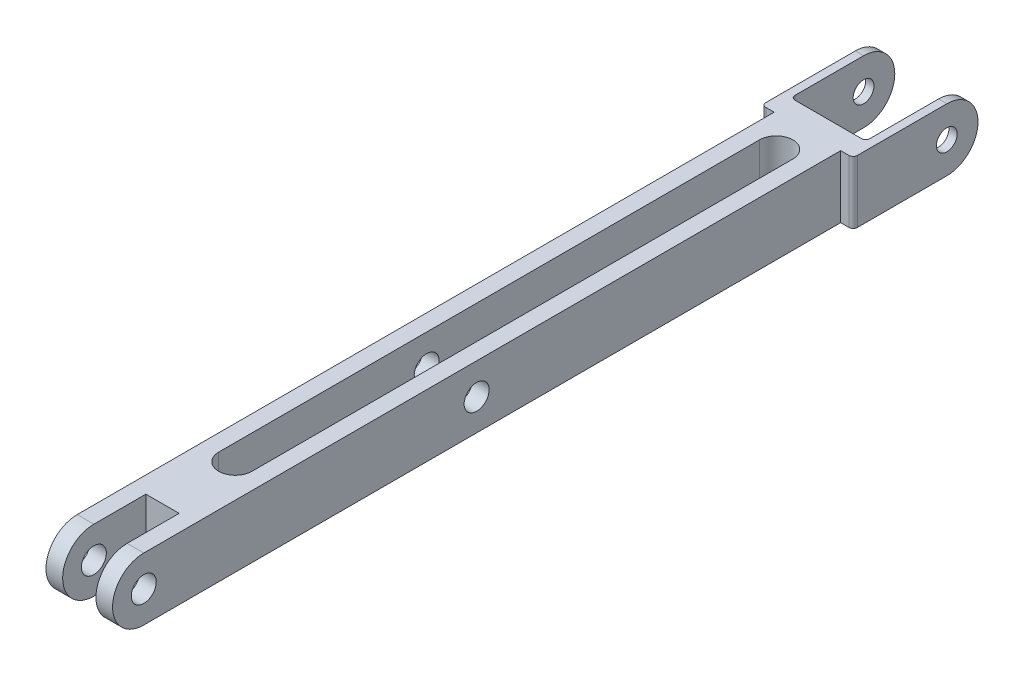
ISO-10303-21;
HEADER;
FILE_DESCRIPTION(('STEP AP214'),'2;1');
FILE_NAME('part.step','',(''),(''),'','','');
FILE_SCHEMA(('AUTOMOTIVE_DESIGN { 1 0 10303 214 1 1 1 1 }'));
ENDSEC;
DATA;
#1=APPLICATION_CONTEXT('core data for automotive mechanical design processes');
#2=APPLICATION_PROTOCOL_DEFINITION('international standard','automotive_design',2000,#1);
#3=PRODUCT_CONTEXT('',#1,'mechanical');
#4=PRODUCT('Part','Part','',(#3));
#5=PRODUCT_RELATED_PRODUCT_CATEGORY('part','',(#4));
#6=PRODUCT_DEFINITION_FORMATION('','',#4);
#7=PRODUCT_DEFINITION_CONTEXT('part definition',#1,'design');
#8=PRODUCT_DEFINITION('design','',#6,#7);
#9=PRODUCT_DEFINITION_SHAPE('','',#8);
#10=(LENGTH_UNIT() NAMED_UNIT(*) SI_UNIT(.MILLI.,.METRE.));
#11=(NAMED_UNIT(*) PLANE_ANGLE_UNIT() SI_UNIT($,.RADIAN.));
#12=(NAMED_UNIT(*) SI_UNIT($,.STERADIAN.) SOLID_ANGLE_UNIT());
#13=UNCERTAINTY_MEASURE_WITH_UNIT(LENGTH_MEASURE(1.E-05),#10,'distance_accuracy_value','');
#14=(GEOMETRIC_REPRESENTATION_CONTEXT(3) GLOBAL_UNCERTAINTY_ASSIGNED_CONTEXT((#13)) GLOBAL_UNIT_ASSIGNED_CONTEXT((#10,
#11,#12)) REPRESENTATION_CONTEXT('',''));
#15=CARTESIAN_POINT('',(0.,0.,0.));
#16=DIRECTION('',(0.,0.,1.));
#17=DIRECTION('',(1.,0.,0.));
#18=AXIS2_PLACEMENT_3D('',#15,#16,#17);
#19=CARTESIAN_POINT('',(16.,0.,-95.));
#20=DIRECTION('',(-1.,0.,0.));
#21=DIRECTION('',(0.,0.,1.));
#22=AXIS2_PLACEMENT_3D('',#19,#20,#21);
#23=PLANE('',#22);
#24=CARTESIAN_POINT('',(16.,0.,95.));
#25=DIRECTION('',(1.,0.,0.));
#26=DIRECTION('',(0.,0.,-1.));
#27=AXIS2_PLACEMENT_3D('',#24,#25,#26);
#28=CIRCLE('',#27,3.00000000000001);
#29=CARTESIAN_POINT('',(16.,0.,92.));
#30=VERTEX_POINT('',#29);
#31=EDGE_CURVE('E364',#30,#30,#28,.T.);
#32=ORIENTED_EDGE('',*,*,#31,.F.);
#33=EDGE_LOOP('',(#32));
#34=FACE_BOUND('',#33,.T.);
#35=CARTESIAN_POINT('',(16.,0.,15.));
#36=DIRECTION('',(-1.,0.,0.));
#37=DIRECTION('',(0.,0.,1.));
#38=AXIS2_PLACEMENT_3D('',#35,#36,#37);
#39=CIRCLE('',#38,3.);
#40=CARTESIAN_POINT('',(16.,0.,18.));
#41=VERTEX_POINT('',#40);
#42=EDGE_CURVE('E317',#41,#41,#39,.T.);
#43=ORIENTED_EDGE('',*,*,#42,.T.);
#44=EDGE_LOOP('',(#43));
#45=FACE_BOUND('',#44,.T.);
#46=DIRECTION('',(0.,0.,-1.));
#47=VECTOR('',#46,1.);
#48=CARTESIAN_POINT('',(16.,-7.5,95.));
#49=LINE('',#48,#47);
#50=CARTESIAN_POINT('',(16.,-7.5,95.));
#51=VERTEX_POINT('',#50);
#52=CARTESIAN_POINT('',(16.,-7.5,-72.5));
#53=VERTEX_POINT('',#52);
#54=EDGE_CURVE('E427',#51,#53,#49,.T.);
#55=ORIENTED_EDGE('',*,*,#54,.T.);
#56=DIRECTION('',(0.,-1.,0.));
#57=VECTOR('',#56,1.);
#58=CARTESIAN_POINT('',(16.,44.7021504754766,-72.5));
#59=LINE('',#58,#57);
#60=CARTESIAN_POINT('',(16.,7.5,-72.5));
#61=VERTEX_POINT('',#60);
#62=EDGE_CURVE('E300',#61,#53,#59,.T.);
#63=ORIENTED_EDGE('',*,*,#62,.F.);
#64=DIRECTION('',(0.,0.,1.));
#65=VECTOR('',#64,1.);
#66=CARTESIAN_POINT('',(16.,7.5,95.));
#67=LINE('',#66,#65);
#68=CARTESIAN_POINT('',(16.,7.5,95.));
#69=VERTEX_POINT('',#68);
#70=EDGE_CURVE('E420',#61,#69,#67,.T.);
#71=ORIENTED_EDGE('',*,*,#70,.T.);
#72=CARTESIAN_POINT('',(16.,0.,95.));
#73=DIRECTION('',(1.,0.,0.));
#74=DIRECTION('',(0.,0.,-1.));
#75=AXIS2_PLACEMENT_3D('',#72,#73,#74);
#76=CIRCLE('',#75,7.5);
#77=EDGE_CURVE('E423',#69,#51,#76,.T.);
#78=ORIENTED_EDGE('',*,*,#77,.T.);
#79=EDGE_LOOP('',(#55,#63,#71,#78));
#80=FACE_BOUND('',#79,.T.);
#81=ADVANCED_FACE('F39',(#34,#45,#80),#23,.F.);
#82=CARTESIAN_POINT('',(16.,0.,95.));
#83=DIRECTION('',(-1.,0.,0.));
#84=DIRECTION('',(0.,0.,1.));
#85=AXIS2_PLACEMENT_3D('',#82,#83,#84);
#86=CYLINDRICAL_SURFACE('',#85,7.5);
#87=DIRECTION('',(-1.,0.,0.));
#88=VECTOR('',#87,1.);
#89=CARTESIAN_POINT('',(16.,7.5,95.));
#90=LINE('',#89,#88);
#91=CARTESIAN_POINT('',(12.,7.5,95.));
#92=VERTEX_POINT('',#91);
#93=EDGE_CURVE('E445',#69,#92,#90,.T.);
#94=ORIENTED_EDGE('',*,*,#93,.T.);
#95=CARTESIAN_POINT('',(12.,0.,95.));
#96=DIRECTION('',(1.,0.,0.));
#97=DIRECTION('',(0.,0.,-1.));
#98=AXIS2_PLACEMENT_3D('',#95,#96,#97);
#99=CIRCLE('',#98,7.5);
#100=CARTESIAN_POINT('',(12.,-7.5,95.));
#101=VERTEX_POINT('',#100);
#102=EDGE_CURVE('E416',#92,#101,#99,.T.);
#103=ORIENTED_EDGE('',*,*,#102,.T.);
#104=DIRECTION('',(-1.,0.,0.));
#105=VECTOR('',#104,1.);
#106=CARTESIAN_POINT('',(16.,-7.5,95.));
#107=LINE('',#106,#105);
#108=EDGE_CURVE('E440',#51,#101,#107,.T.);
#109=ORIENTED_EDGE('',*,*,#108,.F.);
#110=ORIENTED_EDGE('',*,*,#77,.F.);
#111=EDGE_LOOP('',(#94,#103,#109,#110));
#112=FACE_BOUND('',#111,.T.);
#113=ADVANCED_FACE('F559',(#112),#86,.T.);
#114=CARTESIAN_POINT('',(16.,7.5,95.));
#115=DIRECTION('',(0.,-1.,0.));
#116=DIRECTION('',(0.,0.,-1.));
#117=AXIS2_PLACEMENT_3D('',#114,#115,#116);
#118=PLANE('',#117);
#119=DIRECTION('',(0.,0.,-1.));
#120=VECTOR('',#119,1.);
#121=CARTESIAN_POINT('',(19.,7.5,-102.5));
#122=LINE('',#121,#120);
#123=CARTESIAN_POINT('',(19.,7.5,-73.5));
#124=VERTEX_POINT('',#123);
#125=CARTESIAN_POINT('',(19.,7.5,-95.));
#126=VERTEX_POINT('',#125);
#127=EDGE_CURVE('E510',#124,#126,#122,.T.);
#128=ORIENTED_EDGE('',*,*,#127,.T.);
#129=DIRECTION('',(-1.,0.,0.));
#130=VECTOR('',#129,1.);
#131=CARTESIAN_POINT('',(17.,7.5,-95.));
#132=LINE('',#131,#130);
#133=CARTESIAN_POINT('',(17.,7.5,-95.));
#134=VERTEX_POINT('',#133);
#135=EDGE_CURVE('E463',#126,#134,#132,.T.);
#136=ORIENTED_EDGE('',*,*,#135,.T.);
#137=DIRECTION('',(0.,0.,1.));
#138=VECTOR('',#137,1.);
#139=CARTESIAN_POINT('',(17.,7.5,-78.5));
#140=LINE('',#139,#138);
#141=CARTESIAN_POINT('',(17.,7.5,-78.5));
#142=VERTEX_POINT('',#141);
#143=EDGE_CURVE('E285',#134,#142,#140,.T.);
#144=ORIENTED_EDGE('',*,*,#143,.T.);
#145=CARTESIAN_POINT('',(16.,7.5,-78.5));
#146=DIRECTION('',(0.,-1.,0.));
#147=DIRECTION('',(0.,0.,-1.));
#148=AXIS2_PLACEMENT_3D('',#145,#146,#147);
#149=CIRCLE('',#148,0.999999999999999);
#150=CARTESIAN_POINT('',(16.,7.5,-77.5));
#151=VERTEX_POINT('',#150);
#152=EDGE_CURVE('E313',#142,#151,#149,.T.);
#153=ORIENTED_EDGE('',*,*,#152,.T.);
#154=DIRECTION('',(1.,0.,0.));
#155=VECTOR('',#154,1.);
#156=CARTESIAN_POINT('',(4.,7.5,-77.5));
#157=LINE('',#156,#155);
#158=CARTESIAN_POINT('',(0.,7.5,-77.5));
#159=VERTEX_POINT('',#158);
#160=EDGE_CURVE('E227',#159,#151,#157,.T.);
#161=ORIENTED_EDGE('',*,*,#160,.F.);
#162=CARTESIAN_POINT('',(0.,7.5,-78.5));
#163=DIRECTION('',(0.,-1.,0.));
#164=DIRECTION('',(0.,0.,-1.));
#165=AXIS2_PLACEMENT_3D('',#162,#163,#164);
#166=CIRCLE('',#165,1.);
#167=CARTESIAN_POINT('',(-0.999999999999991,7.5,-78.5));
#168=VERTEX_POINT('',#167);
#169=EDGE_CURVE('E253',#159,#168,#166,.T.);
#170=ORIENTED_EDGE('',*,*,#169,.T.);
#171=DIRECTION('',(0.,0.,-1.));
#172=VECTOR('',#171,1.);
#173=CARTESIAN_POINT('',(-0.999999999999991,7.5,-78.5));
#174=LINE('',#173,#172);
#175=CARTESIAN_POINT('',(-0.999999999999989,7.5,-95.));
#176=VERTEX_POINT('',#175);
#177=EDGE_CURVE('E529',#168,#176,#174,.T.);
#178=ORIENTED_EDGE('',*,*,#177,.T.);
#179=DIRECTION('',(-1.,0.,0.));
#180=VECTOR('',#179,1.);
#181=CARTESIAN_POINT('',(-2.99999999999999,7.5,-95.));
#182=LINE('',#181,#180);
#183=CARTESIAN_POINT('',(-2.99999999999999,7.5,-95.));
#184=VERTEX_POINT('',#183);
#185=EDGE_CURVE('E453',#176,#184,#182,.T.);
#186=ORIENTED_EDGE('',*,*,#185,.T.);
#187=DIRECTION('',(0.,0.,1.));
#188=VECTOR('',#187,1.);
#189=CARTESIAN_POINT('',(-2.99999999999999,7.5,-102.5));
#190=LINE('',#189,#188);
#191=CARTESIAN_POINT('',(-2.99999999999999,7.5,-73.5));
#192=VERTEX_POINT('',#191);
#193=EDGE_CURVE('E527',#184,#192,#190,.T.);
#194=ORIENTED_EDGE('',*,*,#193,.T.);
#195=CARTESIAN_POINT('',(-1.99999999999999,7.5,-73.5));
#196=DIRECTION('',(0.,-1.,0.));
#197=DIRECTION('',(0.,0.,-1.));
#198=AXIS2_PLACEMENT_3D('',#195,#196,#197);
#199=CIRCLE('',#198,1.);
#200=CARTESIAN_POINT('',(-1.99999999999999,7.5,-72.5));
#201=VERTEX_POINT('',#200);
#202=EDGE_CURVE('E524',#192,#201,#199,.F.);
#203=ORIENTED_EDGE('',*,*,#202,.T.);
#204=DIRECTION('',(1.,0.,0.));
#205=VECTOR('',#204,1.);
#206=CARTESIAN_POINT('',(-1.99999999999999,7.5,-72.5));
#207=LINE('',#206,#205);
#208=CARTESIAN_POINT('',(0.,7.5,-72.5));
#209=VERTEX_POINT('',#208);
#210=EDGE_CURVE('E520',#201,#209,#207,.T.);
#211=ORIENTED_EDGE('',*,*,#210,.T.);
#212=DIRECTION('',(0.,0.,1.));
#213=VECTOR('',#212,1.);
#214=CARTESIAN_POINT('',(0.,7.5,95.));
#215=LINE('',#214,#213);
#216=CARTESIAN_POINT('',(0.,7.5,95.));
#217=VERTEX_POINT('',#216);
#218=EDGE_CURVE('E419',#209,#217,#215,.T.);
#219=ORIENTED_EDGE('',*,*,#218,.T.);
#220=CARTESIAN_POINT('',(4.,7.5,95.));
#221=VERTEX_POINT('',#220);
#222=EDGE_CURVE('E444',#221,#217,#90,.T.);
#223=ORIENTED_EDGE('',*,*,#222,.F.);
#224=DIRECTION('',(0.,0.,1.));
#225=VECTOR('',#224,1.);
#226=CARTESIAN_POINT('',(4.,7.5,102.5));
#227=LINE('',#226,#225);
#228=CARTESIAN_POINT('',(4.,7.5,82.5));
#229=VERTEX_POINT('',#228);
#230=EDGE_CURVE('E391',#229,#221,#227,.T.);
#231=ORIENTED_EDGE('',*,*,#230,.F.);
#232=DIRECTION('',(-1.,0.,0.));
#233=VECTOR('',#232,1.);
#234=CARTESIAN_POINT('',(4.,7.5,82.5));
#235=LINE('',#234,#233);
#236=CARTESIAN_POINT('',(12.,7.5,82.5));
#237=VERTEX_POINT('',#236);
#238=EDGE_CURVE('E398',#237,#229,#235,.T.);
#239=ORIENTED_EDGE('',*,*,#238,.F.);
#240=DIRECTION('',(0.,0.,-1.));
#241=VECTOR('',#240,1.);
#242=CARTESIAN_POINT('',(12.,7.5,82.5));
#243=LINE('',#242,#241);
#244=EDGE_CURVE('E226',#92,#237,#243,.T.);
#245=ORIENTED_EDGE('',*,*,#244,.F.);
#246=ORIENTED_EDGE('',*,*,#93,.F.);
#247=ORIENTED_EDGE('',*,*,#70,.F.);
#248=DIRECTION('',(1.,0.,0.));
#249=VECTOR('',#248,1.);
#250=CARTESIAN_POINT('',(16.,7.5,-72.5));
#251=LINE('',#250,#249);
#252=CARTESIAN_POINT('',(18.,7.5,-72.5));
#253=VERTEX_POINT('',#252);
#254=EDGE_CURVE('E517',#61,#253,#251,.T.);
#255=ORIENTED_EDGE('',*,*,#254,.T.);
#256=CARTESIAN_POINT('',(18.,7.5,-73.5));
#257=DIRECTION('',(0.,-1.,0.));
#258=DIRECTION('',(0.,0.,-1.));
#259=AXIS2_PLACEMENT_3D('',#256,#257,#258);
#260=CIRCLE('',#259,1.);
#261=EDGE_CURVE('E514',#253,#124,#260,.F.);
#262=ORIENTED_EDGE('',*,*,#261,.T.);
#263=EDGE_LOOP('',(#128,#136,#144,#153,#161,#170,#178,#186,#194,#203,#211,#219,#223,#231,#239,
#245,#246,#247,#255,#262));
#264=FACE_BOUND('',#263,.T.);
#265=DIRECTION('',(0.,0.,1.));
#266=VECTOR('',#265,1.);
#267=CARTESIAN_POINT('',(12.,7.5,65.));
#268=LINE('',#267,#266);
#269=CARTESIAN_POINT('',(12.,7.5,-65.));
#270=VERTEX_POINT('',#269);
#271=CARTESIAN_POINT('',(12.,7.5,65.));
#272=VERTEX_POINT('',#271);
#273=EDGE_CURVE('E343',#270,#272,#268,.T.);
#274=ORIENTED_EDGE('',*,*,#273,.T.);
#275=CARTESIAN_POINT('',(7.99999999999998,7.5,65.));
#276=DIRECTION('',(0.,-1.,0.));
#277=DIRECTION('',(0.,0.,-1.));
#278=AXIS2_PLACEMENT_3D('',#275,#276,#277);
#279=CIRCLE('',#278,4.);
#280=CARTESIAN_POINT('',(3.99999999999998,7.5,65.));
#281=VERTEX_POINT('',#280);
#282=EDGE_CURVE('E330',#272,#281,#279,.T.);
#283=ORIENTED_EDGE('',*,*,#282,.T.);
#284=DIRECTION('',(0.,0.,-1.));
#285=VECTOR('',#284,1.);
#286=CARTESIAN_POINT('',(3.99999999999998,7.5,65.));
#287=LINE('',#286,#285);
#288=CARTESIAN_POINT('',(4.00000000000002,7.5,-65.));
#289=VERTEX_POINT('',#288);
#290=EDGE_CURVE('E334',#281,#289,#287,.T.);
#291=ORIENTED_EDGE('',*,*,#290,.T.);
#292=CARTESIAN_POINT('',(8.00000000000002,7.5,-65.));
#293=DIRECTION('',(0.,-1.,0.));
#294=DIRECTION('',(0.,0.,-1.));
#295=AXIS2_PLACEMENT_3D('',#292,#293,#294);
#296=CIRCLE('',#295,4.);
#297=EDGE_CURVE('E339',#289,#270,#296,.T.);
#298=ORIENTED_EDGE('',*,*,#297,.T.);
#299=EDGE_LOOP('',(#274,#283,#291,#298));
#300=FACE_BOUND('',#299,.T.);
#301=ADVANCED_FACE('F537',(#264,#300),#118,.F.);
#302=CARTESIAN_POINT('',(4.,0.,95.));
#303=DIRECTION('',(-1.,0.,0.));
#304=DIRECTION('',(0.,0.,1.));
#305=AXIS2_PLACEMENT_3D('',#302,#303,#304);
#306=CIRCLE('',#305,7.5);
#307=CARTESIAN_POINT('',(4.,-7.5,95.));
#308=VERTEX_POINT('',#307);
#309=EDGE_CURVE('E408',#308,#221,#306,.T.);
#310=ORIENTED_EDGE('',*,*,#309,.T.);
#311=ORIENTED_EDGE('',*,*,#222,.T.);
#312=CARTESIAN_POINT('',(0.,0.,95.));
#313=DIRECTION('',(1.,0.,0.));
#314=DIRECTION('',(0.,0.,-1.));
#315=AXIS2_PLACEMENT_3D('',#312,#313,#314);
#316=CIRCLE('',#315,7.5);
#317=CARTESIAN_POINT('',(0.,-7.5,95.));
#318=VERTEX_POINT('',#317);
#319=EDGE_CURVE('E433',#217,#318,#316,.T.);
#320=ORIENTED_EDGE('',*,*,#319,.T.);
#321=EDGE_CURVE('E430',#308,#318,#107,.T.);
#322=ORIENTED_EDGE('',*,*,#321,.F.);
#323=EDGE_LOOP('',(#310,#311,#320,#322));
#324=FACE_BOUND('',#323,.T.);
#325=ADVANCED_FACE('F567',(#324),#86,.T.);
#326=CARTESIAN_POINT('',(16.,-7.5,95.));
#327=DIRECTION('',(0.,1.,0.));
#328=DIRECTION('',(0.,0.,1.));
#329=AXIS2_PLACEMENT_3D('',#326,#327,#328);
#330=PLANE('',#329);
#331=DIRECTION('',(0.,0.,-1.));
#332=VECTOR('',#331,1.);
#333=CARTESIAN_POINT('',(-2.99999999999999,-7.5,-102.5));
#334=LINE('',#333,#332);
#335=CARTESIAN_POINT('',(-2.99999999999999,-7.5,-73.5));
#336=VERTEX_POINT('',#335);
#337=CARTESIAN_POINT('',(-2.99999999999999,-7.5,-95.));
#338=VERTEX_POINT('',#337);
#339=EDGE_CURVE('E274',#336,#338,#334,.T.);
#340=ORIENTED_EDGE('',*,*,#339,.T.);
#341=DIRECTION('',(1.,0.,0.));
#342=VECTOR('',#341,1.);
#343=CARTESIAN_POINT('',(-0.999999999999987,-7.5,-95.));
#344=LINE('',#343,#342);
#345=CARTESIAN_POINT('',(-0.999999999999989,-7.5,-95.));
#346=VERTEX_POINT('',#345);
#347=EDGE_CURVE('E11',#338,#346,#344,.T.);
#348=ORIENTED_EDGE('',*,*,#347,.T.);
#349=DIRECTION('',(0.,0.,1.));
#350=VECTOR('',#349,1.);
#351=CARTESIAN_POINT('',(-0.999999999999991,-7.5,-78.5));
#352=LINE('',#351,#350);
#353=CARTESIAN_POINT('',(-0.999999999999991,-7.5,-78.5));
#354=VERTEX_POINT('',#353);
#355=EDGE_CURVE('E277',#346,#354,#352,.T.);
#356=ORIENTED_EDGE('',*,*,#355,.T.);
#357=CARTESIAN_POINT('',(0.,-7.5,-78.5));
#358=DIRECTION('',(0.,1.,0.));
#359=DIRECTION('',(0.,0.,-1.));
#360=AXIS2_PLACEMENT_3D('',#357,#358,#359);
#361=CIRCLE('',#360,1.);
#362=CARTESIAN_POINT('',(0.,-7.5,-77.5));
#363=VERTEX_POINT('',#362);
#364=EDGE_CURVE('E221',#354,#363,#361,.T.);
#365=ORIENTED_EDGE('',*,*,#364,.T.);
#366=DIRECTION('',(1.,0.,0.));
#367=VECTOR('',#366,1.);
#368=CARTESIAN_POINT('',(4.,-7.5,-77.5));
#369=LINE('',#368,#367);
#370=CARTESIAN_POINT('',(16.,-7.5,-77.5));
#371=VERTEX_POINT('',#370);
#372=EDGE_CURVE('E213',#363,#371,#369,.T.);
#373=ORIENTED_EDGE('',*,*,#372,.T.);
#374=CARTESIAN_POINT('',(16.,-7.5,-78.5));
#375=DIRECTION('',(0.,1.,0.));
#376=DIRECTION('',(0.,0.,-1.));
#377=AXIS2_PLACEMENT_3D('',#374,#375,#376);
#378=CIRCLE('',#377,0.999999999999999);
#379=CARTESIAN_POINT('',(17.,-7.5,-78.5));
#380=VERTEX_POINT('',#379);
#381=EDGE_CURVE('E219',#371,#380,#378,.T.);
#382=ORIENTED_EDGE('',*,*,#381,.T.);
#383=DIRECTION('',(0.,0.,-1.));
#384=VECTOR('',#383,1.);
#385=CARTESIAN_POINT('',(17.,-7.5,-78.5));
#386=LINE('',#385,#384);
#387=CARTESIAN_POINT('',(17.,-7.5,-95.));
#388=VERTEX_POINT('',#387);
#389=EDGE_CURVE('E242',#380,#388,#386,.T.);
#390=ORIENTED_EDGE('',*,*,#389,.T.);
#391=DIRECTION('',(1.,0.,0.));
#392=VECTOR('',#391,1.);
#393=CARTESIAN_POINT('',(19.,-7.5,-95.));
#394=LINE('',#393,#392);
#395=CARTESIAN_POINT('',(19.,-7.5,-95.));
#396=VERTEX_POINT('',#395);
#397=EDGE_CURVE('E49',#388,#396,#394,.T.);
#398=ORIENTED_EDGE('',*,*,#397,.T.);
#399=DIRECTION('',(0.,0.,1.));
#400=VECTOR('',#399,1.);
#401=CARTESIAN_POINT('',(19.,-7.5,-102.5));
#402=LINE('',#401,#400);
#403=CARTESIAN_POINT('',(19.,-7.5,-73.5));
#404=VERTEX_POINT('',#403);
#405=EDGE_CURVE('E247',#396,#404,#402,.T.);
#406=ORIENTED_EDGE('',*,*,#405,.T.);
#407=CARTESIAN_POINT('',(18.,-7.5,-73.5));
#408=DIRECTION('',(0.,-1.,0.));
#409=DIRECTION('',(0.,0.,-1.));
#410=AXIS2_PLACEMENT_3D('',#407,#408,#409);
#411=CIRCLE('',#410,1.);
#412=CARTESIAN_POINT('',(18.,-7.5,-72.5));
#413=VERTEX_POINT('',#412);
#414=EDGE_CURVE('E258',#404,#413,#411,.T.);
#415=ORIENTED_EDGE('',*,*,#414,.T.);
#416=DIRECTION('',(-1.,0.,0.));
#417=VECTOR('',#416,1.);
#418=CARTESIAN_POINT('',(16.,-7.5,-72.5));
#419=LINE('',#418,#417);
#420=EDGE_CURVE('E262',#413,#53,#419,.T.);
#421=ORIENTED_EDGE('',*,*,#420,.T.);
#422=ORIENTED_EDGE('',*,*,#54,.F.);
#423=ORIENTED_EDGE('',*,*,#108,.T.);
#424=DIRECTION('',(0.,0.,-1.));
#425=VECTOR('',#424,1.);
#426=CARTESIAN_POINT('',(12.,-7.5,95.));
#427=LINE('',#426,#425);
#428=CARTESIAN_POINT('',(12.,-7.5,82.5));
#429=VERTEX_POINT('',#428);
#430=EDGE_CURVE('E449',#101,#429,#427,.T.);
#431=ORIENTED_EDGE('',*,*,#430,.T.);
#432=DIRECTION('',(-1.,0.,0.));
#433=VECTOR('',#432,1.);
#434=CARTESIAN_POINT('',(4.,-7.5,82.5));
#435=LINE('',#434,#433);
#436=CARTESIAN_POINT('',(4.,-7.5,82.5));
#437=VERTEX_POINT('',#436);
#438=EDGE_CURVE('E386',#429,#437,#435,.T.);
#439=ORIENTED_EDGE('',*,*,#438,.T.);
#440=DIRECTION('',(0.,0.,1.));
#441=VECTOR('',#440,1.);
#442=CARTESIAN_POINT('',(4.,-7.5,102.5));
#443=LINE('',#442,#441);
#444=EDGE_CURVE('E390',#437,#308,#443,.T.);
#445=ORIENTED_EDGE('',*,*,#444,.T.);
#446=ORIENTED_EDGE('',*,*,#321,.T.);
#447=DIRECTION('',(0.,0.,-1.));
#448=VECTOR('',#447,1.);
#449=CARTESIAN_POINT('',(0.,-7.5,95.));
#450=LINE('',#449,#448);
#451=CARTESIAN_POINT('',(0.,-7.5,-72.5));
#452=VERTEX_POINT('',#451);
#453=EDGE_CURVE('E424',#318,#452,#450,.T.);
#454=ORIENTED_EDGE('',*,*,#453,.T.);
#455=DIRECTION('',(-1.,0.,0.));
#456=VECTOR('',#455,1.);
#457=CARTESIAN_POINT('',(-1.99999999999999,-7.5,-72.5));
#458=LINE('',#457,#456);
#459=CARTESIAN_POINT('',(-1.99999999999999,-7.5,-72.5));
#460=VERTEX_POINT('',#459);
#461=EDGE_CURVE('E266',#452,#460,#458,.T.);
#462=ORIENTED_EDGE('',*,*,#461,.T.);
#463=CARTESIAN_POINT('',(-1.99999999999999,-7.5,-73.5));
#464=DIRECTION('',(0.,-1.,0.));
#465=DIRECTION('',(0.,0.,1.));
#466=AXIS2_PLACEMENT_3D('',#463,#464,#465);
#467=CIRCLE('',#466,1.);
#468=EDGE_CURVE('E270',#460,#336,#467,.T.);
#469=ORIENTED_EDGE('',*,*,#468,.T.);
#470=EDGE_LOOP('',(#340,#348,#356,#365,#373,#382,#390,#398,#406,#415,#421,#422,#423,#431,#439,
#445,#446,#454,#462,#469));
#471=FACE_BOUND('',#470,.T.);
#472=DIRECTION('',(0.,0.,-1.));
#473=VECTOR('',#472,1.);
#474=CARTESIAN_POINT('',(3.99999999999998,-7.5,65.));
#475=LINE('',#474,#473);
#476=CARTESIAN_POINT('',(3.99999999999998,-7.5,65.));
#477=VERTEX_POINT('',#476);
#478=CARTESIAN_POINT('',(4.00000000000002,-7.5,-65.));
#479=VERTEX_POINT('',#478);
#480=EDGE_CURVE('E350',#477,#479,#475,.T.);
#481=ORIENTED_EDGE('',*,*,#480,.F.);
#482=CARTESIAN_POINT('',(7.99999999999998,-7.5,65.));
#483=DIRECTION('',(0.,-1.,0.));
#484=DIRECTION('',(0.,0.,-1.));
#485=AXIS2_PLACEMENT_3D('',#482,#483,#484);
#486=CIRCLE('',#485,4.);
#487=CARTESIAN_POINT('',(12.,-7.5,65.));
#488=VERTEX_POINT('',#487);
#489=EDGE_CURVE('E329',#488,#477,#486,.T.);
#490=ORIENTED_EDGE('',*,*,#489,.F.);
#491=DIRECTION('',(0.,0.,1.));
#492=VECTOR('',#491,1.);
#493=CARTESIAN_POINT('',(12.,-7.5,65.));
#494=LINE('',#493,#492);
#495=CARTESIAN_POINT('',(12.,-7.5,-65.));
#496=VERTEX_POINT('',#495);
#497=EDGE_CURVE('E335',#496,#488,#494,.T.);
#498=ORIENTED_EDGE('',*,*,#497,.F.);
#499=CARTESIAN_POINT('',(8.00000000000002,-7.5,-65.));
#500=DIRECTION('',(0.,-1.,0.));
#501=DIRECTION('',(0.,0.,-1.));
#502=AXIS2_PLACEMENT_3D('',#499,#500,#501);
#503=CIRCLE('',#502,4.);
#504=EDGE_CURVE('E354',#479,#496,#503,.T.);
#505=ORIENTED_EDGE('',*,*,#504,.F.);
#506=EDGE_LOOP('',(#481,#490,#498,#505));
#507=FACE_BOUND('',#506,.T.);
#508=ADVANCED_FACE('F215',(#471,#507),#330,.F.);
#509=CARTESIAN_POINT('',(0.,0.,-95.));
#510=DIRECTION('',(-1.,0.,0.));
#511=DIRECTION('',(0.,0.,1.));
#512=AXIS2_PLACEMENT_3D('',#509,#510,#511);
#513=PLANE('',#512);
#514=DIRECTION('',(0.,-1.,0.));
#515=VECTOR('',#514,1.);
#516=CARTESIAN_POINT('',(0.,44.7021504754766,-72.5));
#517=LINE('',#516,#515);
#518=EDGE_CURVE('E296',#209,#452,#517,.T.);
#519=ORIENTED_EDGE('',*,*,#518,.T.);
#520=ORIENTED_EDGE('',*,*,#453,.F.);
#521=ORIENTED_EDGE('',*,*,#319,.F.);
#522=ORIENTED_EDGE('',*,*,#218,.F.);
#523=EDGE_LOOP('',(#519,#520,#521,#522));
#524=FACE_BOUND('',#523,.T.);
#525=CARTESIAN_POINT('',(0.,0.,15.));
#526=DIRECTION('',(-1.,0.,0.));
#527=DIRECTION('',(0.,0.,1.));
#528=AXIS2_PLACEMENT_3D('',#525,#526,#527);
#529=CIRCLE('',#528,3.);
#530=CARTESIAN_POINT('',(0.,0.,18.));
#531=VERTEX_POINT('',#530);
#532=EDGE_CURVE('E316',#531,#531,#529,.T.);
#533=ORIENTED_EDGE('',*,*,#532,.F.);
#534=EDGE_LOOP('',(#533));
#535=FACE_BOUND('',#534,.T.);
#536=CARTESIAN_POINT('',(0.,0.,95.));
#537=DIRECTION('',(1.,0.,0.));
#538=DIRECTION('',(0.,0.,-1.));
#539=AXIS2_PLACEMENT_3D('',#536,#537,#538);
#540=CIRCLE('',#539,3.00000000000001);
#541=CARTESIAN_POINT('',(0.,0.,92.));
#542=VERTEX_POINT('',#541);
#543=EDGE_CURVE('E374',#542,#542,#540,.T.);
#544=ORIENTED_EDGE('',*,*,#543,.T.);
#545=EDGE_LOOP('',(#544));
#546=FACE_BOUND('',#545,.T.);
#547=ADVANCED_FACE('F573',(#524,#535,#546),#513,.T.);
#548=CARTESIAN_POINT('',(4.,-7.5,-77.5));
#549=DIRECTION('',(0.,0.,1.));
#550=DIRECTION('',(1.,0.,0.));
#551=AXIS2_PLACEMENT_3D('',#548,#549,#550);
#552=PLANE('',#551);
#553=ORIENTED_EDGE('',*,*,#160,.T.);
#554=DIRECTION('',(0.,-1.,0.));
#555=VECTOR('',#554,1.);
#556=CARTESIAN_POINT('',(16.,44.7021504754766,-77.5));
#557=LINE('',#556,#555);
#558=EDGE_CURVE('E230',#151,#371,#557,.T.);
#559=ORIENTED_EDGE('',*,*,#558,.T.);
#560=ORIENTED_EDGE('',*,*,#372,.F.);
#561=DIRECTION('',(0.,-1.,0.));
#562=VECTOR('',#561,1.);
#563=CARTESIAN_POINT('',(0.,44.7021504754766,-77.5));
#564=LINE('',#563,#562);
#565=EDGE_CURVE('E282',#159,#363,#564,.T.);
#566=ORIENTED_EDGE('',*,*,#565,.F.);
#567=EDGE_LOOP('',(#553,#559,#560,#566));
#568=FACE_BOUND('',#567,.T.);
#569=ADVANCED_FACE('F231',(#568),#552,.F.);
#570=CARTESIAN_POINT('',(12.,-7.5,82.5));
#571=DIRECTION('',(1.,0.,0.));
#572=DIRECTION('',(0.,0.,-1.));
#573=AXIS2_PLACEMENT_3D('',#570,#571,#572);
#574=PLANE('',#573);
#575=CARTESIAN_POINT('',(12.,0.,95.));
#576=DIRECTION('',(1.,0.,0.));
#577=DIRECTION('',(0.,0.,-1.));
#578=AXIS2_PLACEMENT_3D('',#575,#576,#577);
#579=CIRCLE('',#578,3.00000000000001);
#580=CARTESIAN_POINT('',(12.,0.,92.));
#581=VERTEX_POINT('',#580);
#582=EDGE_CURVE('E382',#581,#581,#579,.T.);
#583=ORIENTED_EDGE('',*,*,#582,.T.);
#584=EDGE_LOOP('',(#583));
#585=FACE_BOUND('',#584,.T.);
#586=ORIENTED_EDGE('',*,*,#244,.T.);
#587=DIRECTION('',(0.,1.,0.));
#588=VECTOR('',#587,1.);
#589=CARTESIAN_POINT('',(12.,-7.5,82.5));
#590=LINE('',#589,#588);
#591=EDGE_CURVE('E395',#429,#237,#590,.T.);
#592=ORIENTED_EDGE('',*,*,#591,.F.);
#593=ORIENTED_EDGE('',*,*,#430,.F.);
#594=ORIENTED_EDGE('',*,*,#102,.F.);
#595=EDGE_LOOP('',(#586,#592,#593,#594));
#596=FACE_BOUND('',#595,.T.);
#597=ADVANCED_FACE('F632',(#585,#596),#574,.F.);
#598=CARTESIAN_POINT('',(4.,-7.5,102.5));
#599=DIRECTION('',(-1.,0.,0.));
#600=DIRECTION('',(0.,0.,1.));
#601=AXIS2_PLACEMENT_3D('',#598,#599,#600);
#602=PLANE('',#601);
#603=CARTESIAN_POINT('',(4.,0.,95.));
#604=DIRECTION('',(-1.,0.,0.));
#605=DIRECTION('',(0.,0.,1.));
#606=AXIS2_PLACEMENT_3D('',#603,#604,#605);
#607=CIRCLE('',#606,3.00000000000001);
#608=CARTESIAN_POINT('',(4.,0.,98.));
#609=VERTEX_POINT('',#608);
#610=EDGE_CURVE('E378',#609,#609,#607,.T.);
#611=ORIENTED_EDGE('',*,*,#610,.T.);
#612=EDGE_LOOP('',(#611));
#613=FACE_BOUND('',#612,.T.);
#614=ORIENTED_EDGE('',*,*,#309,.F.);
#615=ORIENTED_EDGE('',*,*,#444,.F.);
#616=DIRECTION('',(0.,1.,0.));
#617=VECTOR('',#616,1.);
#618=CARTESIAN_POINT('',(4.,-7.5,82.5));
#619=LINE('',#618,#617);
#620=EDGE_CURVE('E405',#437,#229,#619,.T.);
#621=ORIENTED_EDGE('',*,*,#620,.T.);
#622=ORIENTED_EDGE('',*,*,#230,.T.);
#623=EDGE_LOOP('',(#614,#615,#621,#622));
#624=FACE_BOUND('',#623,.T.);
#625=ADVANCED_FACE('F625',(#613,#624),#602,.F.);
#626=CARTESIAN_POINT('',(4.,-7.5,82.5));
#627=DIRECTION('',(0.,0.,-1.));
#628=DIRECTION('',(-1.,0.,0.));
#629=AXIS2_PLACEMENT_3D('',#626,#627,#628);
#630=PLANE('',#629);
#631=ORIENTED_EDGE('',*,*,#238,.T.);
#632=ORIENTED_EDGE('',*,*,#620,.F.);
#633=ORIENTED_EDGE('',*,*,#438,.F.);
#634=ORIENTED_EDGE('',*,*,#591,.T.);
#635=EDGE_LOOP('',(#631,#632,#633,#634));
#636=FACE_BOUND('',#635,.T.);
#637=ADVANCED_FACE('F629',(#636),#630,.F.);
#638=CARTESIAN_POINT('',(0.,0.,95.));
#639=DIRECTION('',(1.,0.,0.));
#640=DIRECTION('',(0.,0.,-1.));
#641=AXIS2_PLACEMENT_3D('',#638,#639,#640);
#642=CYLINDRICAL_SURFACE('',#641,3.00000000000001);
#643=ORIENTED_EDGE('',*,*,#543,.F.);
#644=EDGE_LOOP('',(#643));
#645=FACE_BOUND('',#644,.T.);
#646=ORIENTED_EDGE('',*,*,#610,.F.);
#647=EDGE_LOOP('',(#646));
#648=FACE_BOUND('',#647,.T.);
#649=ADVANCED_FACE('F696',(#645,#648),#642,.F.);
#650=ORIENTED_EDGE('',*,*,#31,.T.);
#651=EDGE_LOOP('',(#650));
#652=FACE_BOUND('',#651,.T.);
#653=ORIENTED_EDGE('',*,*,#582,.F.);
#654=EDGE_LOOP('',(#653));
#655=FACE_BOUND('',#654,.T.);
#656=ADVANCED_FACE('F692',(#652,#655),#642,.F.);
#657=CARTESIAN_POINT('',(7.99999999999998,7.5,65.));
#658=DIRECTION('',(0.,-1.,0.));
#659=DIRECTION('',(0.,0.,-1.));
#660=AXIS2_PLACEMENT_3D('',#657,#658,#659);
#661=CYLINDRICAL_SURFACE('',#660,4.);
#662=ORIENTED_EDGE('',*,*,#489,.T.);
#663=DIRECTION('',(0.,-1.,0.));
#664=VECTOR('',#663,1.);
#665=CARTESIAN_POINT('',(3.99999999999998,7.5,65.));
#666=LINE('',#665,#664);
#667=EDGE_CURVE('E347',#281,#477,#666,.T.);
#668=ORIENTED_EDGE('',*,*,#667,.F.);
#669=ORIENTED_EDGE('',*,*,#282,.F.);
#670=DIRECTION('',(0.,-1.,0.));
#671=VECTOR('',#670,1.);
#672=CARTESIAN_POINT('',(12.,7.5,65.));
#673=LINE('',#672,#671);
#674=EDGE_CURVE('E361',#272,#488,#673,.T.);
#675=ORIENTED_EDGE('',*,*,#674,.T.);
#676=EDGE_LOOP('',(#662,#668,#669,#675));
#677=FACE_BOUND('',#676,.T.);
#678=ADVANCED_FACE('F681',(#677),#661,.F.);
#679=CARTESIAN_POINT('',(12.,7.5,65.));
#680=DIRECTION('',(1.,0.,0.));
#681=DIRECTION('',(0.,0.,-1.));
#682=AXIS2_PLACEMENT_3D('',#679,#680,#681);
#683=PLANE('',#682);
#684=CARTESIAN_POINT('',(12.,0.,15.));
#685=DIRECTION('',(1.,0.,0.));
#686=DIRECTION('',(0.,0.,-1.));
#687=AXIS2_PLACEMENT_3D('',#684,#685,#686);
#688=CIRCLE('',#687,3.);
#689=CARTESIAN_POINT('',(12.,0.,12.));
#690=VERTEX_POINT('',#689);
#691=EDGE_CURVE('E325',#690,#690,#688,.T.);
#692=ORIENTED_EDGE('',*,*,#691,.T.);
#693=EDGE_LOOP('',(#692));
#694=FACE_BOUND('',#693,.T.);
#695=ORIENTED_EDGE('',*,*,#497,.T.);
#696=ORIENTED_EDGE('',*,*,#674,.F.);
#697=ORIENTED_EDGE('',*,*,#273,.F.);
#698=DIRECTION('',(0.,-1.,0.));
#699=VECTOR('',#698,1.);
#700=CARTESIAN_POINT('',(12.,7.5,-65.));
#701=LINE('',#700,#699);
#702=EDGE_CURVE('E365',#270,#496,#701,.T.);
#703=ORIENTED_EDGE('',*,*,#702,.T.);
#704=EDGE_LOOP('',(#695,#696,#697,#703));
#705=FACE_BOUND('',#704,.T.);
#706=ADVANCED_FACE('F677',(#694,#705),#683,.F.);
#707=CARTESIAN_POINT('',(8.00000000000002,7.5,-65.));
#708=DIRECTION('',(0.,-1.,0.));
#709=DIRECTION('',(0.,0.,-1.));
#710=AXIS2_PLACEMENT_3D('',#707,#708,#709);
#711=CYLINDRICAL_SURFACE('',#710,4.);
#712=ORIENTED_EDGE('',*,*,#504,.T.);
#713=ORIENTED_EDGE('',*,*,#702,.F.);
#714=ORIENTED_EDGE('',*,*,#297,.F.);
#715=DIRECTION('',(0.,-1.,0.));
#716=VECTOR('',#715,1.);
#717=CARTESIAN_POINT('',(4.00000000000002,7.5,-65.));
#718=LINE('',#717,#716);
#719=EDGE_CURVE('E368',#289,#479,#718,.T.);
#720=ORIENTED_EDGE('',*,*,#719,.T.);
#721=EDGE_LOOP('',(#712,#713,#714,#720));
#722=FACE_BOUND('',#721,.T.);
#723=ADVANCED_FACE('F680',(#722),#711,.F.);
#724=CARTESIAN_POINT('',(3.99999999999998,7.5,65.));
#725=DIRECTION('',(-1.,0.,0.));
#726=DIRECTION('',(0.,0.,1.));
#727=AXIS2_PLACEMENT_3D('',#724,#725,#726);
#728=PLANE('',#727);
#729=CARTESIAN_POINT('',(3.99999999999999,0.,15.));
#730=DIRECTION('',(-1.,0.,0.));
#731=DIRECTION('',(0.,0.,1.));
#732=AXIS2_PLACEMENT_3D('',#729,#730,#731);
#733=CIRCLE('',#732,3.);
#734=CARTESIAN_POINT('',(3.99999999999999,0.,18.));
#735=VERTEX_POINT('',#734);
#736=EDGE_CURVE('E321',#735,#735,#733,.T.);
#737=ORIENTED_EDGE('',*,*,#736,.T.);
#738=EDGE_LOOP('',(#737));
#739=FACE_BOUND('',#738,.T.);
#740=ORIENTED_EDGE('',*,*,#480,.T.);
#741=ORIENTED_EDGE('',*,*,#719,.F.);
#742=ORIENTED_EDGE('',*,*,#290,.F.);
#743=ORIENTED_EDGE('',*,*,#667,.T.);
#744=EDGE_LOOP('',(#740,#741,#742,#743));
#745=FACE_BOUND('',#744,.T.);
#746=ADVANCED_FACE('F685',(#739,#745),#728,.F.);
#747=CARTESIAN_POINT('',(16.,0.,15.));
#748=DIRECTION('',(-1.,0.,0.));
#749=DIRECTION('',(0.,0.,1.));
#750=AXIS2_PLACEMENT_3D('',#747,#748,#749);
#751=CYLINDRICAL_SURFACE('',#750,3.);
#752=ORIENTED_EDGE('',*,*,#532,.T.);
#753=EDGE_LOOP('',(#752));
#754=FACE_BOUND('',#753,.T.);
#755=ORIENTED_EDGE('',*,*,#736,.F.);
#756=EDGE_LOOP('',(#755));
#757=FACE_BOUND('',#756,.T.);
#758=ADVANCED_FACE('F675',(#754,#757),#751,.F.);
#759=ORIENTED_EDGE('',*,*,#42,.F.);
#760=EDGE_LOOP('',(#759));
#761=FACE_BOUND('',#760,.T.);
#762=ORIENTED_EDGE('',*,*,#691,.F.);
#763=EDGE_LOOP('',(#762));
#764=FACE_BOUND('',#763,.T.);
#765=ADVANCED_FACE('F672',(#761,#764),#751,.F.);
#766=CARTESIAN_POINT('',(-1.99999999999999,44.7021504754766,-73.5));
#767=DIRECTION('',(0.,-1.,0.));
#768=DIRECTION('',(0.,0.,-1.));
#769=AXIS2_PLACEMENT_3D('',#766,#767,#768);
#770=CYLINDRICAL_SURFACE('',#769,1.);
#771=ORIENTED_EDGE('',*,*,#202,.F.);
#772=DIRECTION('',(0.,-1.,0.));
#773=VECTOR('',#772,1.);
#774=CARTESIAN_POINT('',(-2.99999999999999,44.7021504754766,-73.5));
#775=LINE('',#774,#773);
#776=EDGE_CURVE('E290',#192,#336,#775,.T.);
#777=ORIENTED_EDGE('',*,*,#776,.T.);
#778=ORIENTED_EDGE('',*,*,#468,.F.);
#779=DIRECTION('',(0.,-1.,0.));
#780=VECTOR('',#779,1.);
#781=CARTESIAN_POINT('',(-1.99999999999999,44.7021504754766,-72.5));
#782=LINE('',#781,#780);
#783=EDGE_CURVE('E293',#201,#460,#782,.T.);
#784=ORIENTED_EDGE('',*,*,#783,.F.);
#785=EDGE_LOOP('',(#771,#777,#778,#784));
#786=FACE_BOUND('',#785,.T.);
#787=ADVANCED_FACE('F609',(#786),#770,.T.);
#788=CARTESIAN_POINT('',(-2.99999999999999,44.7021504754766,-102.5));
#789=DIRECTION('',(-1.,0.,0.));
#790=DIRECTION('',(0.,0.,1.));
#791=AXIS2_PLACEMENT_3D('',#788,#789,#790);
#792=PLANE('',#791);
#793=CARTESIAN_POINT('',(-2.99999999999999,0.,-95.));
#794=DIRECTION('',(1.,0.,0.));
#795=DIRECTION('',(0.,0.,-1.));
#796=AXIS2_PLACEMENT_3D('',#793,#794,#795);
#797=CIRCLE('',#796,2.49999999999999);
#798=CARTESIAN_POINT('',(-2.99999999999999,0.,-97.5));
#799=VERTEX_POINT('',#798);
#800=EDGE_CURVE('E503',#799,#799,#797,.T.);
#801=ORIENTED_EDGE('',*,*,#800,.T.);
#802=EDGE_LOOP('',(#801));
#803=FACE_BOUND('',#802,.T.);
#804=ORIENTED_EDGE('',*,*,#193,.F.);
#805=CARTESIAN_POINT('',(-2.99999999999999,0.,-95.));
#806=DIRECTION('',(-1.,0.,0.));
#807=DIRECTION('',(0.,0.,1.));
#808=AXIS2_PLACEMENT_3D('',#805,#806,#807);
#809=CIRCLE('',#808,7.5);
#810=CARTESIAN_POINT('',(-2.99999999999999,0.,-102.5));
#811=VERTEX_POINT('',#810);
#812=EDGE_CURVE('E482',#184,#811,#809,.T.);
#813=ORIENTED_EDGE('',*,*,#812,.T.);
#814=CARTESIAN_POINT('',(-2.99999999999999,0.,-95.));
#815=DIRECTION('',(-1.,0.,0.));
#816=DIRECTION('',(0.,0.,1.));
#817=AXIS2_PLACEMENT_3D('',#814,#815,#816);
#818=CIRCLE('',#817,7.5);
#819=EDGE_CURVE('E479',#811,#338,#818,.T.);
#820=ORIENTED_EDGE('',*,*,#819,.T.);
#821=ORIENTED_EDGE('',*,*,#339,.F.);
#822=ORIENTED_EDGE('',*,*,#776,.F.);
#823=EDGE_LOOP('',(#804,#813,#820,#821,#822));
#824=FACE_BOUND('',#823,.T.);
#825=ADVANCED_FACE('F604',(#803,#824),#792,.T.);
#826=CARTESIAN_POINT('',(-0.999999999999991,44.7021504754766,-78.5));
#827=DIRECTION('',(1.,0.,0.));
#828=DIRECTION('',(0.,0.,-1.));
#829=AXIS2_PLACEMENT_3D('',#826,#827,#828);
#830=PLANE('',#829);
#831=CARTESIAN_POINT('',(-0.999999999999989,0.,-95.));
#832=DIRECTION('',(1.,0.,0.));
#833=DIRECTION('',(0.,0.,-1.));
#834=AXIS2_PLACEMENT_3D('',#831,#832,#833);
#835=CIRCLE('',#834,2.49999999999999);
#836=CARTESIAN_POINT('',(-0.999999999999989,0.,-97.5));
#837=VERTEX_POINT('',#836);
#838=EDGE_CURVE('E493',#837,#837,#835,.T.);
#839=ORIENTED_EDGE('',*,*,#838,.F.);
#840=EDGE_LOOP('',(#839));
#841=FACE_BOUND('',#840,.T.);
#842=CARTESIAN_POINT('',(-0.999999999999987,0.,-95.));
#843=DIRECTION('',(1.,0.,0.));
#844=DIRECTION('',(0.,0.,-1.));
#845=AXIS2_PLACEMENT_3D('',#842,#843,#844);
#846=CIRCLE('',#845,7.5);
#847=CARTESIAN_POINT('',(-0.999999999999988,0.,-102.5));
#848=VERTEX_POINT('',#847);
#849=EDGE_CURVE('E57',#346,#848,#846,.T.);
#850=ORIENTED_EDGE('',*,*,#849,.T.);
#851=CARTESIAN_POINT('',(-0.999999999999987,0.,-95.));
#852=DIRECTION('',(1.,0.,0.));
#853=DIRECTION('',(0.,0.,-1.));
#854=AXIS2_PLACEMENT_3D('',#851,#852,#853);
#855=CIRCLE('',#854,7.5);
#856=EDGE_CURVE('E487',#848,#176,#855,.T.);
#857=ORIENTED_EDGE('',*,*,#856,.T.);
#858=ORIENTED_EDGE('',*,*,#177,.F.);
#859=DIRECTION('',(0.,-1.,0.));
#860=VECTOR('',#859,1.);
#861=CARTESIAN_POINT('',(-0.999999999999991,44.7021504754766,-78.5));
#862=LINE('',#861,#860);
#863=EDGE_CURVE('E286',#168,#354,#862,.T.);
#864=ORIENTED_EDGE('',*,*,#863,.T.);
#865=ORIENTED_EDGE('',*,*,#355,.F.);
#866=EDGE_LOOP('',(#850,#857,#858,#864,#865));
#867=FACE_BOUND('',#866,.T.);
#868=ADVANCED_FACE('F541',(#841,#867),#830,.T.);
#869=CARTESIAN_POINT('',(-1.99999999999999,44.7021504754766,-72.5));
#870=DIRECTION('',(0.,0.,1.));
#871=DIRECTION('',(1.,0.,0.));
#872=AXIS2_PLACEMENT_3D('',#869,#870,#871);
#873=PLANE('',#872);
#874=ORIENTED_EDGE('',*,*,#210,.F.);
#875=ORIENTED_EDGE('',*,*,#783,.T.);
#876=ORIENTED_EDGE('',*,*,#461,.F.);
#877=ORIENTED_EDGE('',*,*,#518,.F.);
#878=EDGE_LOOP('',(#874,#875,#876,#877));
#879=FACE_BOUND('',#878,.T.);
#880=ADVANCED_FACE('F545',(#879),#873,.T.);
#881=CARTESIAN_POINT('',(0.,44.7021504754766,-78.5));
#882=DIRECTION('',(0.,-1.,0.));
#883=DIRECTION('',(0.,0.,-1.));
#884=AXIS2_PLACEMENT_3D('',#881,#882,#883);
#885=CYLINDRICAL_SURFACE('',#884,1.);
#886=ORIENTED_EDGE('',*,*,#169,.F.);
#887=ORIENTED_EDGE('',*,*,#565,.T.);
#888=ORIENTED_EDGE('',*,*,#364,.F.);
#889=ORIENTED_EDGE('',*,*,#863,.F.);
#890=EDGE_LOOP('',(#886,#887,#888,#889));
#891=FACE_BOUND('',#890,.T.);
#892=ADVANCED_FACE('F542',(#891),#885,.F.);
#893=CARTESIAN_POINT('',(16.,44.7021504754766,-72.5));
#894=DIRECTION('',(0.,0.,1.));
#895=DIRECTION('',(1.,0.,0.));
#896=AXIS2_PLACEMENT_3D('',#893,#894,#895);
#897=PLANE('',#896);
#898=ORIENTED_EDGE('',*,*,#254,.F.);
#899=ORIENTED_EDGE('',*,*,#62,.T.);
#900=ORIENTED_EDGE('',*,*,#420,.F.);
#901=DIRECTION('',(0.,-1.,0.));
#902=VECTOR('',#901,1.);
#903=CARTESIAN_POINT('',(18.,44.7021504754766,-72.5));
#904=LINE('',#903,#902);
#905=EDGE_CURVE('E304',#253,#413,#904,.T.);
#906=ORIENTED_EDGE('',*,*,#905,.F.);
#907=EDGE_LOOP('',(#898,#899,#900,#906));
#908=FACE_BOUND('',#907,.T.);
#909=ADVANCED_FACE('F544',(#908),#897,.T.);
#910=CARTESIAN_POINT('',(18.,44.7021504754766,-73.5));
#911=DIRECTION('',(0.,-1.,0.));
#912=DIRECTION('',(0.,0.,-1.));
#913=AXIS2_PLACEMENT_3D('',#910,#911,#912);
#914=CYLINDRICAL_SURFACE('',#913,1.);
#915=ORIENTED_EDGE('',*,*,#261,.F.);
#916=ORIENTED_EDGE('',*,*,#905,.T.);
#917=ORIENTED_EDGE('',*,*,#414,.F.);
#918=DIRECTION('',(0.,-1.,0.));
#919=VECTOR('',#918,1.);
#920=CARTESIAN_POINT('',(19.,44.7021504754766,-73.5));
#921=LINE('',#920,#919);
#922=EDGE_CURVE('E307',#124,#404,#921,.T.);
#923=ORIENTED_EDGE('',*,*,#922,.F.);
#924=EDGE_LOOP('',(#915,#916,#917,#923));
#925=FACE_BOUND('',#924,.T.);
#926=ADVANCED_FACE('F551',(#925),#914,.T.);
#927=CARTESIAN_POINT('',(19.,44.7021504754766,-102.5));
#928=DIRECTION('',(1.,0.,0.));
#929=DIRECTION('',(0.,0.,-1.));
#930=AXIS2_PLACEMENT_3D('',#927,#928,#929);
#931=PLANE('',#930);
#932=CARTESIAN_POINT('',(19.,0.,-95.));
#933=DIRECTION('',(1.,0.,0.));
#934=DIRECTION('',(0.,0.,-1.));
#935=AXIS2_PLACEMENT_3D('',#932,#933,#934);
#936=CIRCLE('',#935,2.49999999999999);
#937=CARTESIAN_POINT('',(19.,0.,-97.5));
#938=VERTEX_POINT('',#937);
#939=EDGE_CURVE('E506',#938,#938,#936,.T.);
#940=ORIENTED_EDGE('',*,*,#939,.F.);
#941=EDGE_LOOP('',(#940));
#942=FACE_BOUND('',#941,.T.);
#943=CARTESIAN_POINT('',(19.,0.,-95.));
#944=DIRECTION('',(1.,0.,0.));
#945=DIRECTION('',(0.,0.,-1.));
#946=AXIS2_PLACEMENT_3D('',#943,#944,#945);
#947=CIRCLE('',#946,7.5);
#948=CARTESIAN_POINT('',(19.,0.,-102.5));
#949=VERTEX_POINT('',#948);
#950=EDGE_CURVE('E473',#396,#949,#947,.T.);
#951=ORIENTED_EDGE('',*,*,#950,.T.);
#952=CARTESIAN_POINT('',(19.,0.,-95.));
#953=DIRECTION('',(1.,0.,0.));
#954=DIRECTION('',(0.,0.,-1.));
#955=AXIS2_PLACEMENT_3D('',#952,#953,#954);
#956=CIRCLE('',#955,7.5);
#957=EDGE_CURVE('E476',#949,#126,#956,.T.);
#958=ORIENTED_EDGE('',*,*,#957,.T.);
#959=ORIENTED_EDGE('',*,*,#127,.F.);
#960=ORIENTED_EDGE('',*,*,#922,.T.);
#961=ORIENTED_EDGE('',*,*,#405,.F.);
#962=EDGE_LOOP('',(#951,#958,#959,#960,#961));
#963=FACE_BOUND('',#962,.T.);
#964=ADVANCED_FACE('F651',(#942,#963),#931,.T.);
#965=CARTESIAN_POINT('',(17.,44.7021504754766,-78.5));
#966=DIRECTION('',(-1.,0.,0.));
#967=DIRECTION('',(0.,0.,1.));
#968=AXIS2_PLACEMENT_3D('',#965,#966,#967);
#969=PLANE('',#968);
#970=CARTESIAN_POINT('',(17.,0.,-95.));
#971=DIRECTION('',(-1.,0.,0.));
#972=DIRECTION('',(0.,0.,1.));
#973=AXIS2_PLACEMENT_3D('',#970,#971,#972);
#974=CIRCLE('',#973,2.49999999999999);
#975=CARTESIAN_POINT('',(17.,0.,-92.5));
#976=VERTEX_POINT('',#975);
#977=EDGE_CURVE('E43',#976,#976,#974,.T.);
#978=ORIENTED_EDGE('',*,*,#977,.F.);
#979=EDGE_LOOP('',(#978));
#980=FACE_BOUND('',#979,.T.);
#981=ORIENTED_EDGE('',*,*,#143,.F.);
#982=CARTESIAN_POINT('',(17.,0.,-95.));
#983=DIRECTION('',(-1.,0.,0.));
#984=DIRECTION('',(0.,0.,1.));
#985=AXIS2_PLACEMENT_3D('',#982,#983,#984);
#986=CIRCLE('',#985,7.5);
#987=CARTESIAN_POINT('',(17.,0.,-102.5));
#988=VERTEX_POINT('',#987);
#989=EDGE_CURVE('E470',#134,#988,#986,.T.);
#990=ORIENTED_EDGE('',*,*,#989,.T.);
#991=CARTESIAN_POINT('',(17.,0.,-95.));
#992=DIRECTION('',(-1.,0.,0.));
#993=DIRECTION('',(0.,0.,1.));
#994=AXIS2_PLACEMENT_3D('',#991,#992,#993);
#995=CIRCLE('',#994,7.5);
#996=EDGE_CURVE('E467',#988,#388,#995,.T.);
#997=ORIENTED_EDGE('',*,*,#996,.T.);
#998=ORIENTED_EDGE('',*,*,#389,.F.);
#999=DIRECTION('',(0.,-1.,0.));
#1000=VECTOR('',#999,1.);
#1001=CARTESIAN_POINT('',(17.,44.7021504754766,-78.5));
#1002=LINE('',#1001,#1000);
#1003=EDGE_CURVE('E236',#142,#380,#1002,.T.);
#1004=ORIENTED_EDGE('',*,*,#1003,.F.);
#1005=EDGE_LOOP('',(#981,#990,#997,#998,#1004));
#1006=FACE_BOUND('',#1005,.T.);
#1007=ADVANCED_FACE('F658',(#980,#1006),#969,.T.);
#1008=CARTESIAN_POINT('',(16.,44.7021504754766,-78.5));
#1009=DIRECTION('',(0.,-1.,0.));
#1010=DIRECTION('',(0.,0.,-1.));
#1011=AXIS2_PLACEMENT_3D('',#1008,#1009,#1010);
#1012=CYLINDRICAL_SURFACE('',#1011,0.999999999999999);
#1013=ORIENTED_EDGE('',*,*,#152,.F.);
#1014=ORIENTED_EDGE('',*,*,#1003,.T.);
#1015=ORIENTED_EDGE('',*,*,#381,.F.);
#1016=ORIENTED_EDGE('',*,*,#558,.F.);
#1017=EDGE_LOOP('',(#1013,#1014,#1015,#1016));
#1018=FACE_BOUND('',#1017,.T.);
#1019=ADVANCED_FACE('F238',(#1018),#1012,.F.);
#1020=CARTESIAN_POINT('',(16.,0.,-95.));
#1021=DIRECTION('',(-1.,0.,0.));
#1022=DIRECTION('',(0.,0.,1.));
#1023=AXIS2_PLACEMENT_3D('',#1020,#1021,#1022);
#1024=CYLINDRICAL_SURFACE('',#1023,7.5);
#1025=DIRECTION('',(1.,0.,0.));
#1026=VECTOR('',#1025,1.);
#1027=CARTESIAN_POINT('',(17.,0.,-102.5));
#1028=LINE('',#1027,#1026);
#1029=EDGE_CURVE('E243',#949,#988,#1028,.F.);
#1030=ORIENTED_EDGE('',*,*,#1029,.F.);
#1031=ORIENTED_EDGE('',*,*,#950,.F.);
#1032=ORIENTED_EDGE('',*,*,#397,.F.);
#1033=ORIENTED_EDGE('',*,*,#996,.F.);
#1034=EDGE_LOOP('',(#1030,#1031,#1032,#1033));
#1035=FACE_BOUND('',#1034,.T.);
#1036=ADVANCED_FACE('F586',(#1035),#1024,.T.);
#1037=CARTESIAN_POINT('',(16.,0.,-95.));
#1038=DIRECTION('',(1.,0.,0.));
#1039=DIRECTION('',(0.,0.,-1.));
#1040=AXIS2_PLACEMENT_3D('',#1037,#1038,#1039);
#1041=CYLINDRICAL_SURFACE('',#1040,7.5);
#1042=ORIENTED_EDGE('',*,*,#957,.F.);
#1043=ORIENTED_EDGE('',*,*,#1029,.T.);
#1044=ORIENTED_EDGE('',*,*,#989,.F.);
#1045=ORIENTED_EDGE('',*,*,#135,.F.);
#1046=EDGE_LOOP('',(#1042,#1043,#1044,#1045));
#1047=FACE_BOUND('',#1046,.T.);
#1048=ADVANCED_FACE('F583',(#1047),#1041,.T.);
#1049=CARTESIAN_POINT('',(16.,0.,-95.));
#1050=DIRECTION('',(-1.,0.,0.));
#1051=DIRECTION('',(0.,0.,1.));
#1052=AXIS2_PLACEMENT_3D('',#1049,#1050,#1051);
#1053=CYLINDRICAL_SURFACE('',#1052,7.5);
#1054=DIRECTION('',(1.,0.,0.));
#1055=VECTOR('',#1054,1.);
#1056=CARTESIAN_POINT('',(-2.99999999999999,0.,-102.5));
#1057=LINE('',#1056,#1055);
#1058=EDGE_CURVE('E250',#848,#811,#1057,.F.);
#1059=ORIENTED_EDGE('',*,*,#1058,.F.);
#1060=ORIENTED_EDGE('',*,*,#849,.F.);
#1061=ORIENTED_EDGE('',*,*,#347,.F.);
#1062=ORIENTED_EDGE('',*,*,#819,.F.);
#1063=EDGE_LOOP('',(#1059,#1060,#1061,#1062));
#1064=FACE_BOUND('',#1063,.T.);
#1065=ADVANCED_FACE('F41',(#1064),#1053,.T.);
#1066=CARTESIAN_POINT('',(16.,0.,-95.));
#1067=DIRECTION('',(1.,0.,0.));
#1068=DIRECTION('',(0.,0.,-1.));
#1069=AXIS2_PLACEMENT_3D('',#1066,#1067,#1068);
#1070=CYLINDRICAL_SURFACE('',#1069,7.5);
#1071=ORIENTED_EDGE('',*,*,#856,.F.);
#1072=ORIENTED_EDGE('',*,*,#1058,.T.);
#1073=ORIENTED_EDGE('',*,*,#812,.F.);
#1074=ORIENTED_EDGE('',*,*,#185,.F.);
#1075=EDGE_LOOP('',(#1071,#1072,#1073,#1074));
#1076=FACE_BOUND('',#1075,.T.);
#1077=ADVANCED_FACE('F590',(#1076),#1070,.T.);
#1078=CARTESIAN_POINT('',(-2.99999999999999,0.,-95.));
#1079=DIRECTION('',(1.,0.,0.));
#1080=DIRECTION('',(0.,0.,-1.));
#1081=AXIS2_PLACEMENT_3D('',#1078,#1079,#1080);
#1082=CYLINDRICAL_SURFACE('',#1081,2.49999999999999);
#1083=ORIENTED_EDGE('',*,*,#977,.T.);
#1084=EDGE_LOOP('',(#1083));
#1085=FACE_BOUND('',#1084,.T.);
#1086=ORIENTED_EDGE('',*,*,#939,.T.);
#1087=EDGE_LOOP('',(#1086));
#1088=FACE_BOUND('',#1087,.T.);
#1089=ADVANCED_FACE('F592',(#1085,#1088),#1082,.F.);
#1090=ORIENTED_EDGE('',*,*,#838,.T.);
#1091=EDGE_LOOP('',(#1090));
#1092=FACE_BOUND('',#1091,.T.);
#1093=ORIENTED_EDGE('',*,*,#800,.F.);
#1094=EDGE_LOOP('',(#1093));
#1095=FACE_BOUND('',#1094,.T.);
#1096=ADVANCED_FACE('F597',(#1092,#1095),#1082,.F.);
#1097=CLOSED_SHELL('',(#81,#113,#301,#325,#508,#547,#569,#597,#625,#637,#649,#656,#678,#706,
#723,#746,#758,#765,#787,#825,#868,#880,#892,#909,#926,#964,#1007,#1019,#1036,#1048,#1065,#1077,
#1089,#1096));
#1098=MANIFOLD_SOLID_BREP('B2',#1097);
#1099=ADVANCED_BREP_SHAPE_REPRESENTATION('',(#18,#1098),#14);
#1100=SHAPE_DEFINITION_REPRESENTATION(#9,#1099);
ENDSEC;
END-ISO-10303-21;
